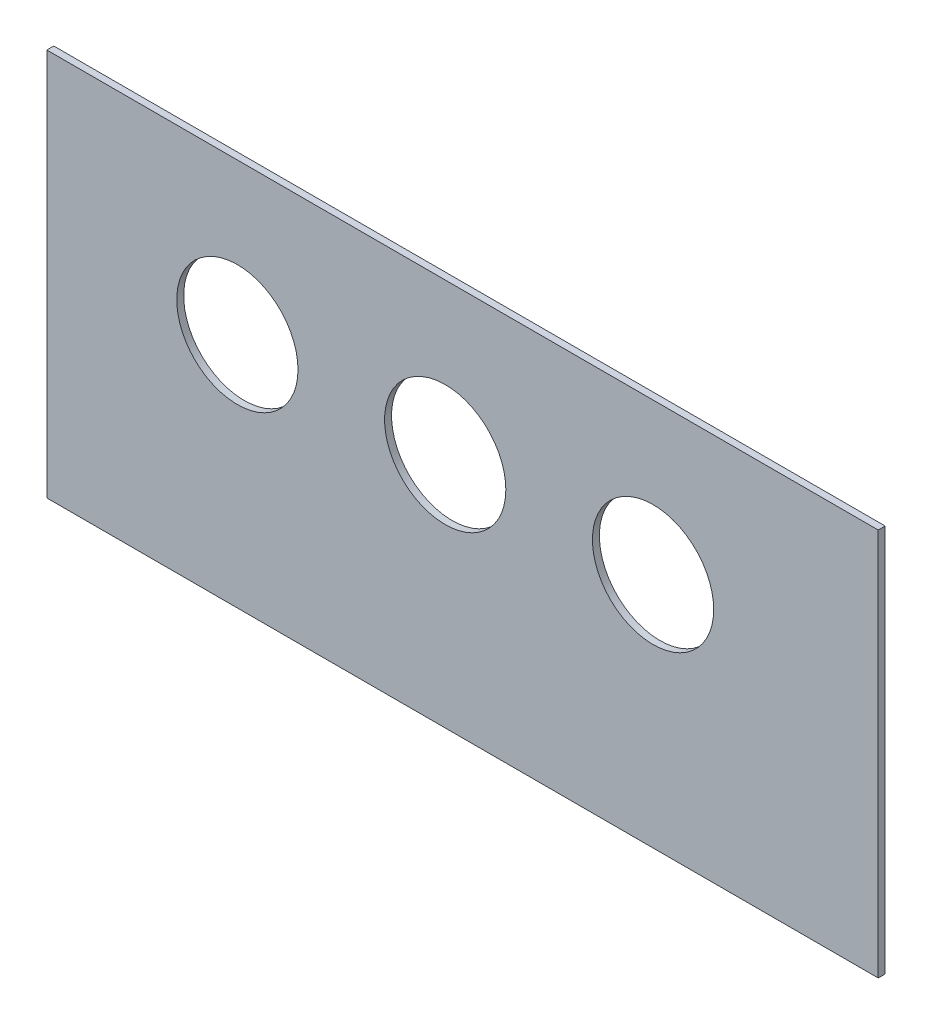
ISO-10303-21;
HEADER;
FILE_DESCRIPTION(('STEP AP214'),'2;1');
FILE_NAME('part.step','',(''),(''),'','','');
FILE_SCHEMA(('AUTOMOTIVE_DESIGN { 1 0 10303 214 1 1 1 1 }'));
ENDSEC;
DATA;
#1=APPLICATION_CONTEXT('core data for automotive mechanical design processes');
#2=APPLICATION_PROTOCOL_DEFINITION('international standard','automotive_design',2000,#1);
#3=PRODUCT_CONTEXT('',#1,'mechanical');
#4=PRODUCT('Part','Part','',(#3));
#5=PRODUCT_RELATED_PRODUCT_CATEGORY('part','',(#4));
#6=PRODUCT_DEFINITION_FORMATION('','',#4);
#7=PRODUCT_DEFINITION_CONTEXT('part definition',#1,'design');
#8=PRODUCT_DEFINITION('design','',#6,#7);
#9=PRODUCT_DEFINITION_SHAPE('','',#8);
#10=(LENGTH_UNIT() NAMED_UNIT(*) SI_UNIT(.MILLI.,.METRE.));
#11=(NAMED_UNIT(*) PLANE_ANGLE_UNIT() SI_UNIT($,.RADIAN.));
#12=(NAMED_UNIT(*) SI_UNIT($,.STERADIAN.) SOLID_ANGLE_UNIT());
#13=UNCERTAINTY_MEASURE_WITH_UNIT(LENGTH_MEASURE(1.E-05),#10,'distance_accuracy_value','');
#14=(GEOMETRIC_REPRESENTATION_CONTEXT(3) GLOBAL_UNCERTAINTY_ASSIGNED_CONTEXT((#13)) GLOBAL_UNIT_ASSIGNED_CONTEXT((#10,
#11,#12)) REPRESENTATION_CONTEXT('',''));
#15=CARTESIAN_POINT('',(0.,0.,0.));
#16=DIRECTION('',(0.,0.,1.));
#17=DIRECTION('',(1.,0.,0.));
#18=AXIS2_PLACEMENT_3D('',#15,#16,#17);
#19=CARTESIAN_POINT('',(0.,0.,10.));
#20=DIRECTION('',(0.,0.,1.));
#21=DIRECTION('',(1.,0.,0.));
#22=AXIS2_PLACEMENT_3D('',#19,#20,#21);
#23=PLANE('',#22);
#24=CARTESIAN_POINT('',(-150.,0.,10.));
#25=DIRECTION('',(0.,0.,1.));
#26=DIRECTION('',(1.,0.,0.));
#27=AXIS2_PLACEMENT_3D('',#24,#25,#26);
#28=CIRCLE('',#27,87.5);
#29=CARTESIAN_POINT('',(-62.5,0.,10.));
#30=VERTEX_POINT('',#29);
#31=EDGE_CURVE('E123',#30,#30,#28,.T.);
#32=ORIENTED_EDGE('',*,*,#31,.F.);
#33=EDGE_LOOP('',(#32));
#34=FACE_BOUND('',#33,.T.);
#35=DIRECTION('',(0.,-1.,0.));
#36=VECTOR('',#35,1.);
#37=CARTESIAN_POINT('',(-725.,218.222891566265,10.));
#38=LINE('',#37,#36);
#39=CARTESIAN_POINT('',(-725.,218.222891566265,10.));
#40=VERTEX_POINT('',#39);
#41=CARTESIAN_POINT('',(-725.,-341.777108433735,10.));
#42=VERTEX_POINT('',#41);
#43=EDGE_CURVE('E93',#40,#42,#38,.T.);
#44=ORIENTED_EDGE('',*,*,#43,.T.);
#45=DIRECTION('',(1.,0.,0.));
#46=VECTOR('',#45,1.);
#47=CARTESIAN_POINT('',(-725.,-341.777108433735,10.));
#48=LINE('',#47,#46);
#49=CARTESIAN_POINT('',(475.,-341.777108433735,10.));
#50=VERTEX_POINT('',#49);
#51=EDGE_CURVE('E88',#42,#50,#48,.T.);
#52=ORIENTED_EDGE('',*,*,#51,.T.);
#53=DIRECTION('',(0.,1.,0.));
#54=VECTOR('',#53,1.);
#55=CARTESIAN_POINT('',(475.,218.222891566265,10.));
#56=LINE('',#55,#54);
#57=CARTESIAN_POINT('',(475.,218.222891566265,10.));
#58=VERTEX_POINT('',#57);
#59=EDGE_CURVE('E91',#50,#58,#56,.T.);
#60=ORIENTED_EDGE('',*,*,#59,.T.);
#61=DIRECTION('',(-1.,0.,0.));
#62=VECTOR('',#61,1.);
#63=CARTESIAN_POINT('',(-725.,218.222891566265,10.));
#64=LINE('',#63,#62);
#65=EDGE_CURVE('E58',#58,#40,#64,.T.);
#66=ORIENTED_EDGE('',*,*,#65,.T.);
#67=EDGE_LOOP('',(#44,#52,#60,#66));
#68=FACE_BOUND('',#67,.T.);
#69=CARTESIAN_POINT('',(150.,0.,10.));
#70=DIRECTION('',(0.,0.,1.));
#71=DIRECTION('',(1.,0.,0.));
#72=AXIS2_PLACEMENT_3D('',#69,#70,#71);
#73=CIRCLE('',#72,87.5);
#74=CARTESIAN_POINT('',(237.5,0.,10.));
#75=VERTEX_POINT('',#74);
#76=EDGE_CURVE('E108',#75,#75,#73,.T.);
#77=ORIENTED_EDGE('',*,*,#76,.F.);
#78=EDGE_LOOP('',(#77));
#79=FACE_BOUND('',#78,.T.);
#80=CARTESIAN_POINT('',(-450.,0.,10.));
#81=DIRECTION('',(0.,0.,1.));
#82=DIRECTION('',(1.,0.,0.));
#83=AXIS2_PLACEMENT_3D('',#80,#81,#82);
#84=CIRCLE('',#83,87.5);
#85=CARTESIAN_POINT('',(-362.5,0.,10.));
#86=VERTEX_POINT('',#85);
#87=EDGE_CURVE('E129',#86,#86,#84,.T.);
#88=ORIENTED_EDGE('',*,*,#87,.F.);
#89=EDGE_LOOP('',(#88));
#90=FACE_BOUND('',#89,.T.);
#91=ADVANCED_FACE('F41',(#34,#68,#79,#90),#23,.T.);
#92=CARTESIAN_POINT('',(0.,0.,0.));
#93=DIRECTION('',(0.,0.,1.));
#94=DIRECTION('',(1.,0.,0.));
#95=AXIS2_PLACEMENT_3D('',#92,#93,#94);
#96=PLANE('',#95);
#97=DIRECTION('',(0.,-1.,0.));
#98=VECTOR('',#97,1.);
#99=CARTESIAN_POINT('',(-725.,218.222891566265,0.));
#100=LINE('',#99,#98);
#101=CARTESIAN_POINT('',(-725.,218.222891566265,0.));
#102=VERTEX_POINT('',#101);
#103=CARTESIAN_POINT('',(-725.,-341.777108433735,0.));
#104=VERTEX_POINT('',#103);
#105=EDGE_CURVE('E105',#102,#104,#100,.T.);
#106=ORIENTED_EDGE('',*,*,#105,.F.);
#107=DIRECTION('',(-1.,0.,0.));
#108=VECTOR('',#107,1.);
#109=CARTESIAN_POINT('',(-725.,218.222891566265,0.));
#110=LINE('',#109,#108);
#111=CARTESIAN_POINT('',(475.,218.222891566265,0.));
#112=VERTEX_POINT('',#111);
#113=EDGE_CURVE('E81',#112,#102,#110,.T.);
#114=ORIENTED_EDGE('',*,*,#113,.F.);
#115=DIRECTION('',(0.,1.,0.));
#116=VECTOR('',#115,1.);
#117=CARTESIAN_POINT('',(475.,218.222891566265,0.));
#118=LINE('',#117,#116);
#119=CARTESIAN_POINT('',(475.,-341.777108433735,0.));
#120=VERTEX_POINT('',#119);
#121=EDGE_CURVE('E75',#120,#112,#118,.T.);
#122=ORIENTED_EDGE('',*,*,#121,.F.);
#123=DIRECTION('',(1.,0.,0.));
#124=VECTOR('',#123,1.);
#125=CARTESIAN_POINT('',(-725.,-341.777108433735,0.));
#126=LINE('',#125,#124);
#127=EDGE_CURVE('E97',#104,#120,#126,.T.);
#128=ORIENTED_EDGE('',*,*,#127,.F.);
#129=EDGE_LOOP('',(#106,#114,#122,#128));
#130=FACE_BOUND('',#129,.T.);
#131=CARTESIAN_POINT('',(150.,0.,0.));
#132=DIRECTION('',(0.,0.,1.));
#133=DIRECTION('',(1.,0.,0.));
#134=AXIS2_PLACEMENT_3D('',#131,#132,#133);
#135=CIRCLE('',#134,87.5);
#136=CARTESIAN_POINT('',(237.5,0.,0.));
#137=VERTEX_POINT('',#136);
#138=EDGE_CURVE('E120',#137,#137,#135,.T.);
#139=ORIENTED_EDGE('',*,*,#138,.T.);
#140=EDGE_LOOP('',(#139));
#141=FACE_BOUND('',#140,.T.);
#142=CARTESIAN_POINT('',(-150.,0.,0.));
#143=DIRECTION('',(0.,0.,1.));
#144=DIRECTION('',(1.,0.,0.));
#145=AXIS2_PLACEMENT_3D('',#142,#143,#144);
#146=CIRCLE('',#145,87.5);
#147=CARTESIAN_POINT('',(-62.5,0.,0.));
#148=VERTEX_POINT('',#147);
#149=EDGE_CURVE('E126',#148,#148,#146,.T.);
#150=ORIENTED_EDGE('',*,*,#149,.T.);
#151=EDGE_LOOP('',(#150));
#152=FACE_BOUND('',#151,.T.);
#153=CARTESIAN_POINT('',(-450.,0.,0.));
#154=DIRECTION('',(0.,0.,1.));
#155=DIRECTION('',(1.,0.,0.));
#156=AXIS2_PLACEMENT_3D('',#153,#154,#155);
#157=CIRCLE('',#156,87.5);
#158=CARTESIAN_POINT('',(-362.5,0.,0.));
#159=VERTEX_POINT('',#158);
#160=EDGE_CURVE('E132',#159,#159,#157,.T.);
#161=ORIENTED_EDGE('',*,*,#160,.T.);
#162=EDGE_LOOP('',(#161));
#163=FACE_BOUND('',#162,.T.);
#164=ADVANCED_FACE('F116',(#130,#141,#152,#163),#96,.F.);
#165=CARTESIAN_POINT('',(-725.,218.222891566265,10.));
#166=DIRECTION('',(1.,0.,0.));
#167=DIRECTION('',(0.,1.,0.));
#168=AXIS2_PLACEMENT_3D('',#165,#166,#167);
#169=PLANE('',#168);
#170=ORIENTED_EDGE('',*,*,#105,.T.);
#171=DIRECTION('',(0.,0.,-1.));
#172=VECTOR('',#171,1.);
#173=CARTESIAN_POINT('',(-725.,-341.777108433735,10.));
#174=LINE('',#173,#172);
#175=EDGE_CURVE('E11',#42,#104,#174,.T.);
#176=ORIENTED_EDGE('',*,*,#175,.F.);
#177=ORIENTED_EDGE('',*,*,#43,.F.);
#178=DIRECTION('',(0.,0.,-1.));
#179=VECTOR('',#178,1.);
#180=CARTESIAN_POINT('',(-725.,218.222891566265,10.));
#181=LINE('',#180,#179);
#182=EDGE_CURVE('E101',#40,#102,#181,.T.);
#183=ORIENTED_EDGE('',*,*,#182,.T.);
#184=EDGE_LOOP('',(#170,#176,#177,#183));
#185=FACE_BOUND('',#184,.T.);
#186=ADVANCED_FACE('F43',(#185),#169,.F.);
#187=CARTESIAN_POINT('',(-725.,-341.777108433735,10.));
#188=DIRECTION('',(0.,1.,0.));
#189=DIRECTION('',(0.,0.,1.));
#190=AXIS2_PLACEMENT_3D('',#187,#188,#189);
#191=PLANE('',#190);
#192=ORIENTED_EDGE('',*,*,#127,.T.);
#193=DIRECTION('',(0.,0.,-1.));
#194=VECTOR('',#193,1.);
#195=CARTESIAN_POINT('',(475.,-341.777108433735,10.));
#196=LINE('',#195,#194);
#197=EDGE_CURVE('E50',#50,#120,#196,.T.);
#198=ORIENTED_EDGE('',*,*,#197,.F.);
#199=ORIENTED_EDGE('',*,*,#51,.F.);
#200=ORIENTED_EDGE('',*,*,#175,.T.);
#201=EDGE_LOOP('',(#192,#198,#199,#200));
#202=FACE_BOUND('',#201,.T.);
#203=ADVANCED_FACE('F96',(#202),#191,.F.);
#204=CARTESIAN_POINT('',(475.,218.222891566265,10.));
#205=DIRECTION('',(-1.,0.,0.));
#206=DIRECTION('',(0.,0.,1.));
#207=AXIS2_PLACEMENT_3D('',#204,#205,#206);
#208=PLANE('',#207);
#209=ORIENTED_EDGE('',*,*,#121,.T.);
#210=DIRECTION('',(0.,0.,-1.));
#211=VECTOR('',#210,1.);
#212=CARTESIAN_POINT('',(475.,218.222891566265,10.));
#213=LINE('',#212,#211);
#214=EDGE_CURVE('E98',#58,#112,#213,.T.);
#215=ORIENTED_EDGE('',*,*,#214,.F.);
#216=ORIENTED_EDGE('',*,*,#59,.F.);
#217=ORIENTED_EDGE('',*,*,#197,.T.);
#218=EDGE_LOOP('',(#209,#215,#216,#217));
#219=FACE_BOUND('',#218,.T.);
#220=ADVANCED_FACE('F99',(#219),#208,.F.);
#221=CARTESIAN_POINT('',(-725.,218.222891566265,10.));
#222=DIRECTION('',(0.,-1.,0.));
#223=DIRECTION('',(1.,0.,0.));
#224=AXIS2_PLACEMENT_3D('',#221,#222,#223);
#225=PLANE('',#224);
#226=ORIENTED_EDGE('',*,*,#113,.T.);
#227=ORIENTED_EDGE('',*,*,#182,.F.);
#228=ORIENTED_EDGE('',*,*,#65,.F.);
#229=ORIENTED_EDGE('',*,*,#214,.T.);
#230=EDGE_LOOP('',(#226,#227,#228,#229));
#231=FACE_BOUND('',#230,.T.);
#232=ADVANCED_FACE('F113',(#231),#225,.F.);
#233=CARTESIAN_POINT('',(150.,0.,10.));
#234=DIRECTION('',(0.,0.,-1.));
#235=DIRECTION('',(-1.,0.,0.));
#236=AXIS2_PLACEMENT_3D('',#233,#234,#235);
#237=CYLINDRICAL_SURFACE('',#236,87.5);
#238=ORIENTED_EDGE('',*,*,#76,.T.);
#239=EDGE_LOOP('',(#238));
#240=FACE_BOUND('',#239,.T.);
#241=ORIENTED_EDGE('',*,*,#138,.F.);
#242=EDGE_LOOP('',(#241));
#243=FACE_BOUND('',#242,.T.);
#244=ADVANCED_FACE('F150',(#240,#243),#237,.F.);
#245=CARTESIAN_POINT('',(-150.,0.,10.));
#246=DIRECTION('',(0.,0.,-1.));
#247=DIRECTION('',(-1.,0.,0.));
#248=AXIS2_PLACEMENT_3D('',#245,#246,#247);
#249=CYLINDRICAL_SURFACE('',#248,87.5);
#250=ORIENTED_EDGE('',*,*,#31,.T.);
#251=EDGE_LOOP('',(#250));
#252=FACE_BOUND('',#251,.T.);
#253=ORIENTED_EDGE('',*,*,#149,.F.);
#254=EDGE_LOOP('',(#253));
#255=FACE_BOUND('',#254,.T.);
#256=ADVANCED_FACE('F204',(#252,#255),#249,.F.);
#257=CARTESIAN_POINT('',(-450.,0.,10.));
#258=DIRECTION('',(0.,0.,-1.));
#259=DIRECTION('',(-1.,0.,0.));
#260=AXIS2_PLACEMENT_3D('',#257,#258,#259);
#261=CYLINDRICAL_SURFACE('',#260,87.5);
#262=ORIENTED_EDGE('',*,*,#87,.T.);
#263=EDGE_LOOP('',(#262));
#264=FACE_BOUND('',#263,.T.);
#265=ORIENTED_EDGE('',*,*,#160,.F.);
#266=EDGE_LOOP('',(#265));
#267=FACE_BOUND('',#266,.T.);
#268=ADVANCED_FACE('F138',(#264,#267),#261,.F.);
#269=CLOSED_SHELL('',(#91,#164,#186,#203,#220,#232,#244,#256,#268));
#270=MANIFOLD_SOLID_BREP('B2',#269);
#271=ADVANCED_BREP_SHAPE_REPRESENTATION('',(#18,#270),#14);
#272=SHAPE_DEFINITION_REPRESENTATION(#9,#271);
ENDSEC;
END-ISO-10303-21;
